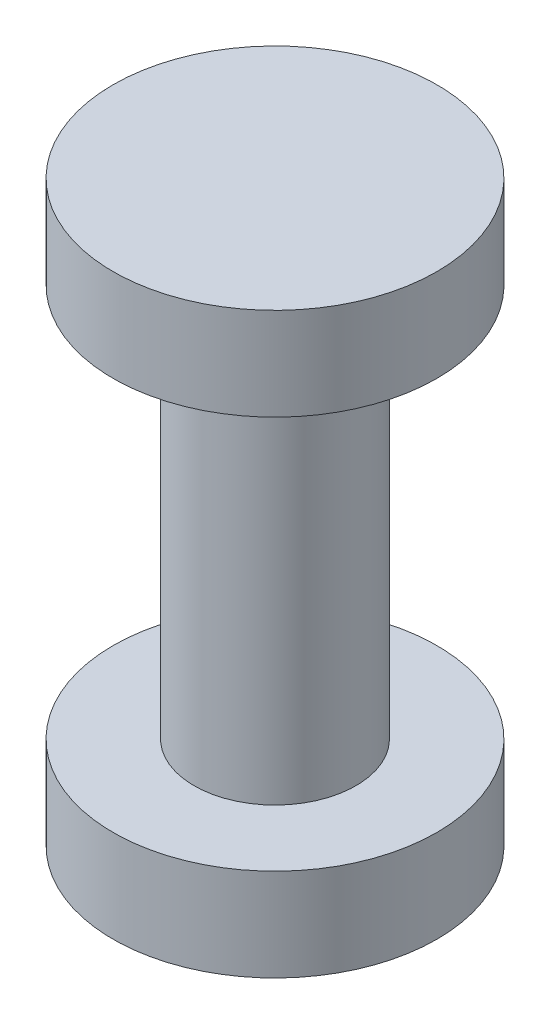
ISO-10303-21;
HEADER;
FILE_DESCRIPTION(('STEP AP214'),'2;1');
FILE_NAME('part.step','',(''),(''),'','','');
FILE_SCHEMA(('AUTOMOTIVE_DESIGN { 1 0 10303 214 1 1 1 1 }'));
ENDSEC;
DATA;
#1=APPLICATION_CONTEXT('core data for automotive mechanical design processes');
#2=APPLICATION_PROTOCOL_DEFINITION('international standard','automotive_design',2000,#1);
#3=PRODUCT_CONTEXT('',#1,'mechanical');
#4=PRODUCT('Part','Part','',(#3));
#5=PRODUCT_RELATED_PRODUCT_CATEGORY('part','',(#4));
#6=PRODUCT_DEFINITION_FORMATION('','',#4);
#7=PRODUCT_DEFINITION_CONTEXT('part definition',#1,'design');
#8=PRODUCT_DEFINITION('design','',#6,#7);
#9=PRODUCT_DEFINITION_SHAPE('','',#8);
#10=(LENGTH_UNIT() NAMED_UNIT(*) SI_UNIT(.MILLI.,.METRE.));
#11=(NAMED_UNIT(*) PLANE_ANGLE_UNIT() SI_UNIT($,.RADIAN.));
#12=(NAMED_UNIT(*) SI_UNIT($,.STERADIAN.) SOLID_ANGLE_UNIT());
#13=UNCERTAINTY_MEASURE_WITH_UNIT(LENGTH_MEASURE(1.E-05),#10,'distance_accuracy_value','');
#14=(GEOMETRIC_REPRESENTATION_CONTEXT(3) GLOBAL_UNCERTAINTY_ASSIGNED_CONTEXT((#13)) GLOBAL_UNIT_ASSIGNED_CONTEXT((#10,
#11,#12)) REPRESENTATION_CONTEXT('',''));
#15=CARTESIAN_POINT('',(0.,0.,0.));
#16=DIRECTION('',(0.,0.,1.));
#17=DIRECTION('',(1.,0.,0.));
#18=AXIS2_PLACEMENT_3D('',#15,#16,#17);
#19=CARTESIAN_POINT('',(0.,-1.14367378524736E-13,0.));
#20=DIRECTION('',(0.,-1.,0.));
#21=DIRECTION('',(1.,0.,0.));
#22=AXIS2_PLACEMENT_3D('',#19,#20,#21);
#23=PLANE('',#22);
#24=CARTESIAN_POINT('',(0.,-2.22044604925031E-13,0.));
#25=DIRECTION('',(0.,1.,0.));
#26=DIRECTION('',(-1.,0.,0.));
#27=AXIS2_PLACEMENT_3D('',#24,#25,#26);
#28=CIRCLE('',#27,1778.);
#29=CARTESIAN_POINT('',(-1778.,-4.50779361974504E-13,0.));
#30=VERTEX_POINT('',#29);
#31=EDGE_CURVE('E53',#30,#30,#28,.T.);
#32=ORIENTED_EDGE('',*,*,#31,.T.);
#33=EDGE_LOOP('',(#32));
#34=FACE_BOUND('',#33,.T.);
#35=ADVANCED_FACE('F31',(#34),#23,.F.);
#36=CARTESIAN_POINT('',(7.73935351366266E-13,-6350.,0.));
#37=DIRECTION('',(0.,1.,0.));
#38=DIRECTION('',(-1.,0.,0.));
#39=AXIS2_PLACEMENT_3D('',#36,#37,#38);
#40=PLANE('',#39);
#41=CARTESIAN_POINT('',(8.10628385941788E-13,-6350.,0.));
#42=DIRECTION('',(0.,1.,0.));
#43=DIRECTION('',(-1.,0.,0.));
#44=AXIS2_PLACEMENT_3D('',#41,#42,#43);
#45=CIRCLE('',#44,1778.);
#46=CARTESIAN_POINT('',(-1778.,-6350.,0.));
#47=VERTEX_POINT('',#46);
#48=EDGE_CURVE('E10',#47,#47,#45,.T.);
#49=ORIENTED_EDGE('',*,*,#48,.F.);
#50=EDGE_LOOP('',(#49));
#51=FACE_BOUND('',#50,.T.);
#52=ADVANCED_FACE('F83',(#51),#40,.F.);
#53=CARTESIAN_POINT('',(1.24424114793371E-13,-1016.,0.));
#54=DIRECTION('',(0.,1.,0.));
#55=DIRECTION('',(-1.,0.,0.));
#56=AXIS2_PLACEMENT_3D('',#53,#54,#55);
#57=CYLINDRICAL_SURFACE('',#56,1778.);
#58=CARTESIAN_POINT('',(6.79922810484946E-13,-5334.,0.));
#59=DIRECTION('',(0.,1.,0.));
#60=DIRECTION('',(-1.,0.,0.));
#61=AXIS2_PLACEMENT_3D('',#58,#59,#60);
#62=CIRCLE('',#61,1778.);
#63=CARTESIAN_POINT('',(-1778.,-5334.,0.));
#64=VERTEX_POINT('',#63);
#65=EDGE_CURVE('E37',#64,#64,#62,.T.);
#66=ORIENTED_EDGE('',*,*,#65,.F.);
#67=EDGE_LOOP('',(#66));
#68=FACE_BOUND('',#67,.T.);
#69=ORIENTED_EDGE('',*,*,#48,.T.);
#70=EDGE_LOOP('',(#69));
#71=FACE_BOUND('',#70,.T.);
#72=ADVANCED_FACE('F78',(#68,#71),#57,.T.);
#73=CARTESIAN_POINT('',(889.000000000001,-5334.,0.));
#74=DIRECTION('',(0.,-1.,0.));
#75=DIRECTION('',(1.,0.,0.));
#76=AXIS2_PLACEMENT_3D('',#73,#74,#75);
#77=PLANE('',#76);
#78=CARTESIAN_POINT('',(6.79922810484946E-13,-5334.,0.));
#79=DIRECTION('',(0.,1.,0.));
#80=DIRECTION('',(-1.,0.,0.));
#81=AXIS2_PLACEMENT_3D('',#78,#79,#80);
#82=CIRCLE('',#81,889.);
#83=CARTESIAN_POINT('',(-888.999999999999,-5334.,0.));
#84=VERTEX_POINT('',#83);
#85=EDGE_CURVE('E41',#84,#84,#82,.T.);
#86=ORIENTED_EDGE('',*,*,#85,.F.);
#87=EDGE_LOOP('',(#86));
#88=FACE_BOUND('',#87,.T.);
#89=ORIENTED_EDGE('',*,*,#65,.T.);
#90=EDGE_LOOP('',(#89));
#91=FACE_BOUND('',#90,.T.);
#92=ADVANCED_FACE('F73',(#88,#91),#77,.F.);
#93=CARTESIAN_POINT('',(1.24424114793371E-13,-1016.,0.));
#94=DIRECTION('',(0.,1.,0.));
#95=DIRECTION('',(-1.,0.,0.));
#96=AXIS2_PLACEMENT_3D('',#93,#94,#95);
#97=CYLINDRICAL_SURFACE('',#96,889.);
#98=CARTESIAN_POINT('',(1.24424114793371E-13,-1016.,0.));
#99=DIRECTION('',(0.,1.,0.));
#100=DIRECTION('',(-1.,0.,0.));
#101=AXIS2_PLACEMENT_3D('',#98,#99,#100);
#102=CIRCLE('',#101,889.);
#103=CARTESIAN_POINT('',(-889.,-1016.,0.));
#104=VERTEX_POINT('',#103);
#105=EDGE_CURVE('E45',#104,#104,#102,.T.);
#106=ORIENTED_EDGE('',*,*,#105,.F.);
#107=EDGE_LOOP('',(#106));
#108=FACE_BOUND('',#107,.T.);
#109=ORIENTED_EDGE('',*,*,#85,.T.);
#110=EDGE_LOOP('',(#109));
#111=FACE_BOUND('',#110,.T.);
#112=ADVANCED_FACE('F67',(#108,#111),#97,.T.);
#113=CARTESIAN_POINT('',(889.,-1016.,0.));
#114=DIRECTION('',(0.,1.,0.));
#115=DIRECTION('',(-1.,0.,0.));
#116=AXIS2_PLACEMENT_3D('',#113,#114,#115);
#117=PLANE('',#116);
#118=CARTESIAN_POINT('',(1.24424114793371E-13,-1016.,0.));
#119=DIRECTION('',(0.,1.,0.));
#120=DIRECTION('',(-1.,0.,0.));
#121=AXIS2_PLACEMENT_3D('',#118,#119,#120);
#122=CIRCLE('',#121,1778.);
#123=CARTESIAN_POINT('',(-1778.,-1016.,0.));
#124=VERTEX_POINT('',#123);
#125=EDGE_CURVE('E50',#124,#124,#122,.T.);
#126=ORIENTED_EDGE('',*,*,#125,.F.);
#127=EDGE_LOOP('',(#126));
#128=FACE_BOUND('',#127,.T.);
#129=ORIENTED_EDGE('',*,*,#105,.T.);
#130=EDGE_LOOP('',(#129));
#131=FACE_BOUND('',#130,.T.);
#132=ADVANCED_FACE('F61',(#128,#131),#117,.F.);
#133=CARTESIAN_POINT('',(1.24424114793371E-13,-1016.,0.));
#134=DIRECTION('',(0.,1.,0.));
#135=DIRECTION('',(-1.,0.,0.));
#136=AXIS2_PLACEMENT_3D('',#133,#134,#135);
#137=CYLINDRICAL_SURFACE('',#136,1778.);
#138=ORIENTED_EDGE('',*,*,#31,.F.);
#139=EDGE_LOOP('',(#138));
#140=FACE_BOUND('',#139,.T.);
#141=ORIENTED_EDGE('',*,*,#125,.T.);
#142=EDGE_LOOP('',(#141));
#143=FACE_BOUND('',#142,.T.);
#144=ADVANCED_FACE('F58',(#140,#143),#137,.T.);
#145=CLOSED_SHELL('',(#35,#52,#72,#92,#112,#132,#144));
#146=MANIFOLD_SOLID_BREP('B2',#145);
#147=ADVANCED_BREP_SHAPE_REPRESENTATION('',(#18,#146),#14);
#148=SHAPE_DEFINITION_REPRESENTATION(#9,#147);
ENDSEC;
END-ISO-10303-21;
